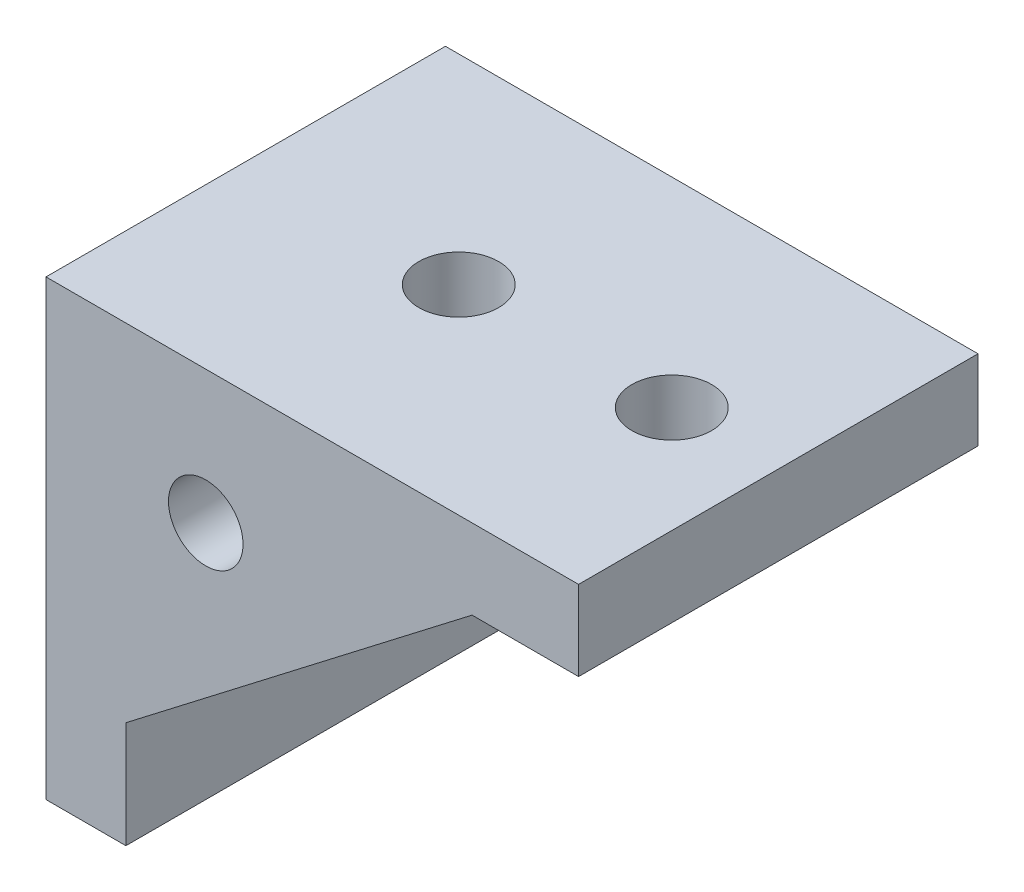
ISO-10303-21;
HEADER;
FILE_DESCRIPTION(('STEP AP214'),'2;1');
FILE_NAME('part.step','',(''),(''),'','','');
FILE_SCHEMA(('AUTOMOTIVE_DESIGN { 1 0 10303 214 1 1 1 1 }'));
ENDSEC;
DATA;
#1=APPLICATION_CONTEXT('core data for automotive mechanical design processes');
#2=APPLICATION_PROTOCOL_DEFINITION('international standard','automotive_design',2000,#1);
#3=PRODUCT_CONTEXT('',#1,'mechanical');
#4=PRODUCT('Part','Part','',(#3));
#5=PRODUCT_RELATED_PRODUCT_CATEGORY('part','',(#4));
#6=PRODUCT_DEFINITION_FORMATION('','',#4);
#7=PRODUCT_DEFINITION_CONTEXT('part definition',#1,'design');
#8=PRODUCT_DEFINITION('design','',#6,#7);
#9=PRODUCT_DEFINITION_SHAPE('','',#8);
#10=(LENGTH_UNIT() NAMED_UNIT(*) SI_UNIT(.MILLI.,.METRE.));
#11=(NAMED_UNIT(*) PLANE_ANGLE_UNIT() SI_UNIT($,.RADIAN.));
#12=(NAMED_UNIT(*) SI_UNIT($,.STERADIAN.) SOLID_ANGLE_UNIT());
#13=UNCERTAINTY_MEASURE_WITH_UNIT(LENGTH_MEASURE(1.E-05),#10,'distance_accuracy_value','');
#14=(GEOMETRIC_REPRESENTATION_CONTEXT(3) GLOBAL_UNCERTAINTY_ASSIGNED_CONTEXT((#13)) GLOBAL_UNIT_ASSIGNED_CONTEXT((#10,
#11,#12)) REPRESENTATION_CONTEXT('',''));
#15=CARTESIAN_POINT('',(0.,0.,0.));
#16=DIRECTION('',(0.,0.,1.));
#17=DIRECTION('',(1.,0.,0.));
#18=AXIS2_PLACEMENT_3D('',#15,#16,#17);
#19=CARTESIAN_POINT('',(-3.,-14.,15.));
#20=DIRECTION('',(0.,1.,0.));
#21=DIRECTION('',(0.,0.,1.));
#22=AXIS2_PLACEMENT_3D('',#19,#20,#21);
#23=PLANE('',#22);
#24=DIRECTION('',(1.,0.,0.));
#25=VECTOR('',#24,1.);
#26=CARTESIAN_POINT('',(-3.,-14.,0.));
#27=LINE('',#26,#25);
#28=CARTESIAN_POINT('',(-3.,-14.,0.));
#29=VERTEX_POINT('',#28);
#30=CARTESIAN_POINT('',(0.,-14.,0.));
#31=VERTEX_POINT('',#30);
#32=EDGE_CURVE('E185',#29,#31,#27,.T.);
#33=ORIENTED_EDGE('',*,*,#32,.T.);
#34=DIRECTION('',(0.,0.,-1.));
#35=VECTOR('',#34,1.);
#36=CARTESIAN_POINT('',(0.,-14.,15.));
#37=LINE('',#36,#35);
#38=CARTESIAN_POINT('',(0.,-14.,15.));
#39=VERTEX_POINT('',#38);
#40=EDGE_CURVE('E221',#39,#31,#37,.T.);
#41=ORIENTED_EDGE('',*,*,#40,.F.);
#42=DIRECTION('',(1.,0.,0.));
#43=VECTOR('',#42,1.);
#44=CARTESIAN_POINT('',(-3.,-14.,15.));
#45=LINE('',#44,#43);
#46=CARTESIAN_POINT('',(-3.,-14.,15.));
#47=VERTEX_POINT('',#46);
#48=EDGE_CURVE('E188',#47,#39,#45,.T.);
#49=ORIENTED_EDGE('',*,*,#48,.F.);
#50=DIRECTION('',(0.,0.,-1.));
#51=VECTOR('',#50,1.);
#52=CARTESIAN_POINT('',(-3.,-14.,15.));
#53=LINE('',#52,#51);
#54=EDGE_CURVE('E203',#47,#29,#53,.T.);
#55=ORIENTED_EDGE('',*,*,#54,.T.);
#56=EDGE_LOOP('',(#33,#41,#49,#55));
#57=FACE_BOUND('',#56,.T.);
#58=ADVANCED_FACE('F34',(#57),#23,.F.);
#59=CARTESIAN_POINT('',(0.,-14.,15.));
#60=DIRECTION('',(-1.,0.,0.));
#61=DIRECTION('',(0.,-1.,0.));
#62=AXIS2_PLACEMENT_3D('',#59,#60,#61);
#63=PLANE('',#62);
#64=CARTESIAN_POINT('',(0.,-6.,7.5));
#65=DIRECTION('',(1.,0.,0.));
#66=DIRECTION('',(0.,1.,0.));
#67=AXIS2_PLACEMENT_3D('',#64,#65,#66);
#68=CIRCLE('',#67,1.5);
#69=CARTESIAN_POINT('',(0.,-4.5,7.5));
#70=VERTEX_POINT('',#69);
#71=EDGE_CURVE('E179',#70,#70,#68,.T.);
#72=ORIENTED_EDGE('',*,*,#71,.F.);
#73=EDGE_LOOP('',(#72));
#74=FACE_BOUND('',#73,.T.);
#75=DIRECTION('',(0.,1.,0.));
#76=VECTOR('',#75,1.);
#77=CARTESIAN_POINT('',(0.,-10.,2.));
#78=LINE('',#77,#76);
#79=CARTESIAN_POINT('',(0.,-10.,2.));
#80=VERTEX_POINT('',#79);
#81=CARTESIAN_POINT('',(0.,-3.,2.));
#82=VERTEX_POINT('',#81);
#83=EDGE_CURVE('E143',#80,#82,#78,.T.);
#84=ORIENTED_EDGE('',*,*,#83,.T.);
#85=DIRECTION('',(0.,0.,-1.));
#86=VECTOR('',#85,1.);
#87=CARTESIAN_POINT('',(0.,-3.,13.));
#88=LINE('',#87,#86);
#89=CARTESIAN_POINT('',(0.,-3.,13.));
#90=VERTEX_POINT('',#89);
#91=EDGE_CURVE('E42',#82,#90,#88,.F.);
#92=ORIENTED_EDGE('',*,*,#91,.T.);
#93=DIRECTION('',(0.,-1.,0.));
#94=VECTOR('',#93,1.);
#95=CARTESIAN_POINT('',(0.,0.,13.));
#96=LINE('',#95,#94);
#97=CARTESIAN_POINT('',(0.,-10.,13.));
#98=VERTEX_POINT('',#97);
#99=EDGE_CURVE('E157',#90,#98,#96,.T.);
#100=ORIENTED_EDGE('',*,*,#99,.T.);
#101=DIRECTION('',(0.,0.,1.));
#102=VECTOR('',#101,1.);
#103=CARTESIAN_POINT('',(0.,-10.,13.));
#104=LINE('',#103,#102);
#105=CARTESIAN_POINT('',(0.,-10.,15.));
#106=VERTEX_POINT('',#105);
#107=EDGE_CURVE('E162',#98,#106,#104,.T.);
#108=ORIENTED_EDGE('',*,*,#107,.T.);
#109=DIRECTION('',(0.,1.,0.));
#110=VECTOR('',#109,1.);
#111=CARTESIAN_POINT('',(0.,-14.,15.));
#112=LINE('',#111,#110);
#113=EDGE_CURVE('E191',#39,#106,#112,.T.);
#114=ORIENTED_EDGE('',*,*,#113,.F.);
#115=ORIENTED_EDGE('',*,*,#40,.T.);
#116=DIRECTION('',(0.,1.,0.));
#117=VECTOR('',#116,1.);
#118=CARTESIAN_POINT('',(0.,-14.,0.));
#119=LINE('',#118,#117);
#120=CARTESIAN_POINT('',(0.,-10.,0.));
#121=VERTEX_POINT('',#120);
#122=EDGE_CURVE('E127',#31,#121,#119,.T.);
#123=ORIENTED_EDGE('',*,*,#122,.T.);
#124=DIRECTION('',(0.,0.,-1.));
#125=VECTOR('',#124,1.);
#126=CARTESIAN_POINT('',(0.,-10.,2.));
#127=LINE('',#126,#125);
#128=EDGE_CURVE('E138',#80,#121,#127,.T.);
#129=ORIENTED_EDGE('',*,*,#128,.F.);
#130=EDGE_LOOP('',(#84,#92,#100,#108,#114,#115,#123,#129));
#131=FACE_BOUND('',#130,.T.);
#132=ADVANCED_FACE('F256',(#74,#131),#63,.F.);
#133=CARTESIAN_POINT('',(0.,0.,15.));
#134=DIRECTION('',(0.,1.,0.));
#135=DIRECTION('',(0.,0.,1.));
#136=AXIS2_PLACEMENT_3D('',#133,#134,#135);
#137=PLANE('',#136);
#138=CARTESIAN_POINT('',(5.,0.,7.5));
#139=DIRECTION('',(0.,-1.,0.));
#140=DIRECTION('',(0.,0.,-1.));
#141=AXIS2_PLACEMENT_3D('',#138,#139,#140);
#142=CIRCLE('',#141,1.5);
#143=CARTESIAN_POINT('',(5.,0.,6.));
#144=VERTEX_POINT('',#143);
#145=EDGE_CURVE('E167',#144,#144,#142,.T.);
#146=ORIENTED_EDGE('',*,*,#145,.F.);
#147=EDGE_LOOP('',(#146));
#148=FACE_BOUND('',#147,.T.);
#149=CARTESIAN_POINT('',(13.,0.,7.5));
#150=DIRECTION('',(0.,-1.,0.));
#151=DIRECTION('',(0.,0.,-1.));
#152=AXIS2_PLACEMENT_3D('',#149,#150,#151);
#153=CIRCLE('',#152,1.5);
#154=CARTESIAN_POINT('',(13.,0.,6.));
#155=VERTEX_POINT('',#154);
#156=EDGE_CURVE('E173',#155,#155,#153,.T.);
#157=ORIENTED_EDGE('',*,*,#156,.F.);
#158=EDGE_LOOP('',(#157));
#159=FACE_BOUND('',#158,.T.);
#160=DIRECTION('',(-1.,0.,0.));
#161=VECTOR('',#160,1.);
#162=CARTESIAN_POINT('',(0.,0.,13.));
#163=LINE('',#162,#161);
#164=CARTESIAN_POINT('',(13.,0.,13.));
#165=VERTEX_POINT('',#164);
#166=CARTESIAN_POINT('',(3.,0.,13.));
#167=VERTEX_POINT('',#166);
#168=EDGE_CURVE('E155',#165,#167,#163,.T.);
#169=ORIENTED_EDGE('',*,*,#168,.T.);
#170=DIRECTION('',(0.,0.,-1.));
#171=VECTOR('',#170,1.);
#172=CARTESIAN_POINT('',(3.,0.,2.));
#173=LINE('',#172,#171);
#174=CARTESIAN_POINT('',(3.,0.,2.));
#175=VERTEX_POINT('',#174);
#176=EDGE_CURVE('E224',#167,#175,#173,.T.);
#177=ORIENTED_EDGE('',*,*,#176,.T.);
#178=DIRECTION('',(1.,0.,0.));
#179=VECTOR('',#178,1.);
#180=CARTESIAN_POINT('',(0.,0.,2.));
#181=LINE('',#180,#179);
#182=CARTESIAN_POINT('',(13.,0.,2.));
#183=VERTEX_POINT('',#182);
#184=EDGE_CURVE('E134',#175,#183,#181,.T.);
#185=ORIENTED_EDGE('',*,*,#184,.T.);
#186=DIRECTION('',(0.,0.,-1.));
#187=VECTOR('',#186,1.);
#188=CARTESIAN_POINT('',(13.,0.,2.));
#189=LINE('',#188,#187);
#190=CARTESIAN_POINT('',(13.,0.,0.));
#191=VERTEX_POINT('',#190);
#192=EDGE_CURVE('E130',#183,#191,#189,.T.);
#193=ORIENTED_EDGE('',*,*,#192,.T.);
#194=DIRECTION('',(1.,0.,0.));
#195=VECTOR('',#194,1.);
#196=CARTESIAN_POINT('',(0.,0.,0.));
#197=LINE('',#196,#195);
#198=CARTESIAN_POINT('',(17.,0.,0.));
#199=VERTEX_POINT('',#198);
#200=EDGE_CURVE('E116',#191,#199,#197,.T.);
#201=ORIENTED_EDGE('',*,*,#200,.T.);
#202=DIRECTION('',(0.,0.,-1.));
#203=VECTOR('',#202,1.);
#204=CARTESIAN_POINT('',(17.,0.,15.));
#205=LINE('',#204,#203);
#206=CARTESIAN_POINT('',(17.,0.,15.));
#207=VERTEX_POINT('',#206);
#208=EDGE_CURVE('E219',#207,#199,#205,.T.);
#209=ORIENTED_EDGE('',*,*,#208,.F.);
#210=DIRECTION('',(1.,0.,0.));
#211=VECTOR('',#210,1.);
#212=CARTESIAN_POINT('',(0.,0.,15.));
#213=LINE('',#212,#211);
#214=CARTESIAN_POINT('',(13.,0.,15.));
#215=VERTEX_POINT('',#214);
#216=EDGE_CURVE('E195',#215,#207,#213,.T.);
#217=ORIENTED_EDGE('',*,*,#216,.F.);
#218=DIRECTION('',(0.,0.,1.));
#219=VECTOR('',#218,1.);
#220=CARTESIAN_POINT('',(13.,0.,13.));
#221=LINE('',#220,#219);
#222=EDGE_CURVE('E165',#165,#215,#221,.T.);
#223=ORIENTED_EDGE('',*,*,#222,.F.);
#224=EDGE_LOOP('',(#169,#177,#185,#193,#201,#209,#217,#223));
#225=FACE_BOUND('',#224,.T.);
#226=ADVANCED_FACE('F132',(#148,#159,#225),#137,.F.);
#227=CARTESIAN_POINT('',(17.,0.,15.));
#228=DIRECTION('',(-1.,0.,0.));
#229=DIRECTION('',(0.,0.,1.));
#230=AXIS2_PLACEMENT_3D('',#227,#228,#229);
#231=PLANE('',#230);
#232=DIRECTION('',(0.,1.,0.));
#233=VECTOR('',#232,1.);
#234=CARTESIAN_POINT('',(17.,0.,0.));
#235=LINE('',#234,#233);
#236=CARTESIAN_POINT('',(17.,3.,0.));
#237=VERTEX_POINT('',#236);
#238=EDGE_CURVE('E123',#199,#237,#235,.T.);
#239=ORIENTED_EDGE('',*,*,#238,.T.);
#240=DIRECTION('',(0.,0.,-1.));
#241=VECTOR('',#240,1.);
#242=CARTESIAN_POINT('',(17.,3.,15.));
#243=LINE('',#242,#241);
#244=CARTESIAN_POINT('',(17.,3.,15.));
#245=VERTEX_POINT('',#244);
#246=EDGE_CURVE('E216',#245,#237,#243,.T.);
#247=ORIENTED_EDGE('',*,*,#246,.F.);
#248=DIRECTION('',(0.,1.,0.));
#249=VECTOR('',#248,1.);
#250=CARTESIAN_POINT('',(17.,0.,15.));
#251=LINE('',#250,#249);
#252=EDGE_CURVE('E197',#207,#245,#251,.T.);
#253=ORIENTED_EDGE('',*,*,#252,.F.);
#254=ORIENTED_EDGE('',*,*,#208,.T.);
#255=EDGE_LOOP('',(#239,#247,#253,#254));
#256=FACE_BOUND('',#255,.T.);
#257=ADVANCED_FACE('F266',(#256),#231,.F.);
#258=CARTESIAN_POINT('',(17.,3.,15.));
#259=DIRECTION('',(0.,-1.,0.));
#260=DIRECTION('',(1.,0.,0.));
#261=AXIS2_PLACEMENT_3D('',#258,#259,#260);
#262=PLANE('',#261);
#263=CARTESIAN_POINT('',(5.,3.,7.5));
#264=DIRECTION('',(0.,-1.,0.));
#265=DIRECTION('',(0.,0.,-1.));
#266=AXIS2_PLACEMENT_3D('',#263,#264,#265);
#267=CIRCLE('',#266,1.5);
#268=CARTESIAN_POINT('',(5.,3.,6.));
#269=VERTEX_POINT('',#268);
#270=EDGE_CURVE('E170',#269,#269,#267,.T.);
#271=ORIENTED_EDGE('',*,*,#270,.T.);
#272=EDGE_LOOP('',(#271));
#273=FACE_BOUND('',#272,.T.);
#274=CARTESIAN_POINT('',(13.,3.,7.5));
#275=DIRECTION('',(0.,-1.,0.));
#276=DIRECTION('',(0.,0.,-1.));
#277=AXIS2_PLACEMENT_3D('',#274,#275,#276);
#278=CIRCLE('',#277,1.5);
#279=CARTESIAN_POINT('',(13.,3.,6.));
#280=VERTEX_POINT('',#279);
#281=EDGE_CURVE('E176',#280,#280,#278,.T.);
#282=ORIENTED_EDGE('',*,*,#281,.T.);
#283=EDGE_LOOP('',(#282));
#284=FACE_BOUND('',#283,.T.);
#285=DIRECTION('',(-1.,0.,0.));
#286=VECTOR('',#285,1.);
#287=CARTESIAN_POINT('',(17.,3.,0.));
#288=LINE('',#287,#286);
#289=CARTESIAN_POINT('',(-3.,3.,0.));
#290=VERTEX_POINT('',#289);
#291=EDGE_CURVE('E208',#237,#290,#288,.T.);
#292=ORIENTED_EDGE('',*,*,#291,.T.);
#293=DIRECTION('',(0.,0.,-1.));
#294=VECTOR('',#293,1.);
#295=CARTESIAN_POINT('',(-3.,3.,15.));
#296=LINE('',#295,#294);
#297=CARTESIAN_POINT('',(-3.,3.,15.));
#298=VERTEX_POINT('',#297);
#299=EDGE_CURVE('E213',#298,#290,#296,.T.);
#300=ORIENTED_EDGE('',*,*,#299,.F.);
#301=DIRECTION('',(-1.,0.,0.));
#302=VECTOR('',#301,1.);
#303=CARTESIAN_POINT('',(17.,3.,15.));
#304=LINE('',#303,#302);
#305=EDGE_CURVE('E199',#245,#298,#304,.T.);
#306=ORIENTED_EDGE('',*,*,#305,.F.);
#307=ORIENTED_EDGE('',*,*,#246,.T.);
#308=EDGE_LOOP('',(#292,#300,#306,#307));
#309=FACE_BOUND('',#308,.T.);
#310=ADVANCED_FACE('F270',(#273,#284,#309),#262,.F.);
#311=CARTESIAN_POINT('',(-3.,3.,15.));
#312=DIRECTION('',(1.,0.,0.));
#313=DIRECTION('',(0.,1.,0.));
#314=AXIS2_PLACEMENT_3D('',#311,#312,#313);
#315=PLANE('',#314);
#316=CARTESIAN_POINT('',(-3.,-6.,7.5));
#317=DIRECTION('',(1.,0.,0.));
#318=DIRECTION('',(0.,1.,0.));
#319=AXIS2_PLACEMENT_3D('',#316,#317,#318);
#320=CIRCLE('',#319,1.5);
#321=CARTESIAN_POINT('',(-3.,-4.5,7.5));
#322=VERTEX_POINT('',#321);
#323=EDGE_CURVE('E182',#322,#322,#320,.T.);
#324=ORIENTED_EDGE('',*,*,#323,.T.);
#325=EDGE_LOOP('',(#324));
#326=FACE_BOUND('',#325,.T.);
#327=DIRECTION('',(0.,-1.,0.));
#328=VECTOR('',#327,1.);
#329=CARTESIAN_POINT('',(-3.,3.,0.));
#330=LINE('',#329,#328);
#331=EDGE_CURVE('E192',#290,#29,#330,.T.);
#332=ORIENTED_EDGE('',*,*,#331,.T.);
#333=ORIENTED_EDGE('',*,*,#54,.F.);
#334=DIRECTION('',(0.,-1.,0.));
#335=VECTOR('',#334,1.);
#336=CARTESIAN_POINT('',(-3.,3.,15.));
#337=LINE('',#336,#335);
#338=EDGE_CURVE('E201',#298,#47,#337,.T.);
#339=ORIENTED_EDGE('',*,*,#338,.F.);
#340=ORIENTED_EDGE('',*,*,#299,.T.);
#341=EDGE_LOOP('',(#332,#333,#339,#340));
#342=FACE_BOUND('',#341,.T.);
#343=ADVANCED_FACE('F274',(#326,#342),#315,.F.);
#344=CARTESIAN_POINT('',(0.,0.,15.));
#345=DIRECTION('',(0.,0.,1.));
#346=DIRECTION('',(1.,0.,0.));
#347=AXIS2_PLACEMENT_3D('',#344,#345,#346);
#348=PLANE('',#347);
#349=CARTESIAN_POINT('',(3.,-2.,15.));
#350=DIRECTION('',(0.,0.,-1.));
#351=DIRECTION('',(-1.,0.,0.));
#352=AXIS2_PLACEMENT_3D('',#349,#350,#351);
#353=CIRCLE('',#352,1.4);
#354=CARTESIAN_POINT('',(1.6,-2.,15.));
#355=VERTEX_POINT('',#354);
#356=EDGE_CURVE('E227',#355,#355,#353,.T.);
#357=ORIENTED_EDGE('',*,*,#356,.T.);
#358=EDGE_LOOP('',(#357));
#359=FACE_BOUND('',#358,.T.);
#360=DIRECTION('',(0.7926239891046,0.609710760849693,0.));
#361=VECTOR('',#360,1.);
#362=CARTESIAN_POINT('',(13.,0.,15.));
#363=LINE('',#362,#361);
#364=EDGE_CURVE('E153',#106,#215,#363,.T.);
#365=ORIENTED_EDGE('',*,*,#364,.T.);
#366=ORIENTED_EDGE('',*,*,#216,.T.);
#367=ORIENTED_EDGE('',*,*,#252,.T.);
#368=ORIENTED_EDGE('',*,*,#305,.T.);
#369=ORIENTED_EDGE('',*,*,#338,.T.);
#370=ORIENTED_EDGE('',*,*,#48,.T.);
#371=ORIENTED_EDGE('',*,*,#113,.T.);
#372=EDGE_LOOP('',(#365,#366,#367,#368,#369,#370,#371));
#373=FACE_BOUND('',#372,.T.);
#374=ADVANCED_FACE('F241',(#359,#373),#348,.T.);
#375=CARTESIAN_POINT('',(0.,0.,0.));
#376=DIRECTION('',(0.,0.,1.));
#377=DIRECTION('',(1.,0.,0.));
#378=AXIS2_PLACEMENT_3D('',#375,#376,#377);
#379=PLANE('',#378);
#380=CARTESIAN_POINT('',(3.,-2.,0.));
#381=DIRECTION('',(0.,0.,-1.));
#382=DIRECTION('',(-1.,0.,0.));
#383=AXIS2_PLACEMENT_3D('',#380,#381,#382);
#384=CIRCLE('',#383,1.4);
#385=CARTESIAN_POINT('',(1.6,-2.,0.));
#386=VERTEX_POINT('',#385);
#387=EDGE_CURVE('E235',#386,#386,#384,.T.);
#388=ORIENTED_EDGE('',*,*,#387,.F.);
#389=EDGE_LOOP('',(#388));
#390=FACE_BOUND('',#389,.T.);
#391=ORIENTED_EDGE('',*,*,#32,.F.);
#392=ORIENTED_EDGE('',*,*,#331,.F.);
#393=ORIENTED_EDGE('',*,*,#291,.F.);
#394=ORIENTED_EDGE('',*,*,#238,.F.);
#395=ORIENTED_EDGE('',*,*,#200,.F.);
#396=DIRECTION('',(-0.7926239891046,-0.609710760849693,0.));
#397=VECTOR('',#396,1.);
#398=CARTESIAN_POINT('',(13.,0.,0.));
#399=LINE('',#398,#397);
#400=EDGE_CURVE('E121',#191,#121,#399,.T.);
#401=ORIENTED_EDGE('',*,*,#400,.T.);
#402=ORIENTED_EDGE('',*,*,#122,.F.);
#403=EDGE_LOOP('',(#391,#392,#393,#394,#395,#401,#402));
#404=FACE_BOUND('',#403,.T.);
#405=ADVANCED_FACE('F119',(#390,#404),#379,.F.);
#406=CARTESIAN_POINT('',(-3.,-6.,7.5));
#407=DIRECTION('',(1.,0.,0.));
#408=DIRECTION('',(0.,1.,0.));
#409=AXIS2_PLACEMENT_3D('',#406,#407,#408);
#410=CYLINDRICAL_SURFACE('',#409,1.5);
#411=ORIENTED_EDGE('',*,*,#323,.F.);
#412=EDGE_LOOP('',(#411));
#413=FACE_BOUND('',#412,.T.);
#414=ORIENTED_EDGE('',*,*,#71,.T.);
#415=EDGE_LOOP('',(#414));
#416=FACE_BOUND('',#415,.T.);
#417=ADVANCED_FACE('F281',(#413,#416),#410,.F.);
#418=CARTESIAN_POINT('',(13.,3.,7.5));
#419=DIRECTION('',(0.,-1.,0.));
#420=DIRECTION('',(0.,0.,-1.));
#421=AXIS2_PLACEMENT_3D('',#418,#419,#420);
#422=CYLINDRICAL_SURFACE('',#421,1.5);
#423=ORIENTED_EDGE('',*,*,#281,.F.);
#424=EDGE_LOOP('',(#423));
#425=FACE_BOUND('',#424,.T.);
#426=ORIENTED_EDGE('',*,*,#156,.T.);
#427=EDGE_LOOP('',(#426));
#428=FACE_BOUND('',#427,.T.);
#429=ADVANCED_FACE('F287',(#425,#428),#422,.F.);
#430=CARTESIAN_POINT('',(5.,3.,7.5));
#431=DIRECTION('',(0.,-1.,0.));
#432=DIRECTION('',(0.,0.,-1.));
#433=AXIS2_PLACEMENT_3D('',#430,#431,#432);
#434=CYLINDRICAL_SURFACE('',#433,1.5);
#435=ORIENTED_EDGE('',*,*,#270,.F.);
#436=EDGE_LOOP('',(#435));
#437=FACE_BOUND('',#436,.T.);
#438=ORIENTED_EDGE('',*,*,#145,.T.);
#439=EDGE_LOOP('',(#438));
#440=FACE_BOUND('',#439,.T.);
#441=ADVANCED_FACE('F291',(#437,#440),#434,.F.);
#442=CARTESIAN_POINT('',(13.,0.,13.));
#443=DIRECTION('',(0.609710760849693,-0.7926239891046,0.));
#444=DIRECTION('',(0.7926239891046,0.609710760849693,0.));
#445=AXIS2_PLACEMENT_3D('',#442,#443,#444);
#446=PLANE('',#445);
#447=ORIENTED_EDGE('',*,*,#364,.F.);
#448=ORIENTED_EDGE('',*,*,#107,.F.);
#449=DIRECTION('',(0.7926239891046,0.609710760849693,0.));
#450=VECTOR('',#449,1.);
#451=CARTESIAN_POINT('',(13.,0.,13.));
#452=LINE('',#451,#450);
#453=EDGE_CURVE('E159',#98,#165,#452,.T.);
#454=ORIENTED_EDGE('',*,*,#453,.T.);
#455=ORIENTED_EDGE('',*,*,#222,.T.);
#456=EDGE_LOOP('',(#447,#448,#454,#455));
#457=FACE_BOUND('',#456,.T.);
#458=ADVANCED_FACE('F295',(#457),#446,.T.);
#459=CARTESIAN_POINT('',(0.,0.,13.));
#460=DIRECTION('',(0.,0.,-1.));
#461=DIRECTION('',(-1.,0.,0.));
#462=AXIS2_PLACEMENT_3D('',#459,#460,#461);
#463=PLANE('',#462);
#464=CARTESIAN_POINT('',(3.,-2.,13.));
#465=DIRECTION('',(0.,0.,-1.));
#466=DIRECTION('',(-1.,0.,0.));
#467=AXIS2_PLACEMENT_3D('',#464,#465,#466);
#468=CIRCLE('',#467,1.4);
#469=CARTESIAN_POINT('',(1.6,-2.,13.));
#470=VERTEX_POINT('',#469);
#471=EDGE_CURVE('E144',#470,#470,#468,.T.);
#472=ORIENTED_EDGE('',*,*,#471,.F.);
#473=EDGE_LOOP('',(#472));
#474=FACE_BOUND('',#473,.T.);
#475=ORIENTED_EDGE('',*,*,#99,.F.);
#476=CARTESIAN_POINT('',(3.,-3.,13.));
#477=DIRECTION('',(0.,0.,-1.));
#478=DIRECTION('',(-1.,0.,0.));
#479=AXIS2_PLACEMENT_3D('',#476,#477,#478);
#480=CIRCLE('',#479,3.);
#481=EDGE_CURVE('E11',#90,#167,#480,.T.);
#482=ORIENTED_EDGE('',*,*,#481,.T.);
#483=ORIENTED_EDGE('',*,*,#168,.F.);
#484=ORIENTED_EDGE('',*,*,#453,.F.);
#485=EDGE_LOOP('',(#475,#482,#483,#484));
#486=FACE_BOUND('',#485,.T.);
#487=ADVANCED_FACE('F299',(#474,#486),#463,.T.);
#488=CARTESIAN_POINT('',(13.,0.,2.));
#489=DIRECTION('',(0.609710760849693,-0.7926239891046,0.));
#490=DIRECTION('',(0.7926239891046,0.609710760849693,0.));
#491=AXIS2_PLACEMENT_3D('',#488,#489,#490);
#492=PLANE('',#491);
#493=ORIENTED_EDGE('',*,*,#400,.F.);
#494=ORIENTED_EDGE('',*,*,#192,.F.);
#495=DIRECTION('',(-0.7926239891046,-0.609710760849693,0.));
#496=VECTOR('',#495,1.);
#497=CARTESIAN_POINT('',(13.,0.,2.));
#498=LINE('',#497,#496);
#499=EDGE_CURVE('E139',#183,#80,#498,.T.);
#500=ORIENTED_EDGE('',*,*,#499,.T.);
#501=ORIENTED_EDGE('',*,*,#128,.T.);
#502=EDGE_LOOP('',(#493,#494,#500,#501));
#503=FACE_BOUND('',#502,.T.);
#504=ADVANCED_FACE('F142',(#503),#492,.T.);
#505=CARTESIAN_POINT('',(0.,0.,2.));
#506=DIRECTION('',(0.,0.,-1.));
#507=DIRECTION('',(-1.,0.,0.));
#508=AXIS2_PLACEMENT_3D('',#505,#506,#507);
#509=PLANE('',#508);
#510=CARTESIAN_POINT('',(3.,-2.,2.));
#511=DIRECTION('',(0.,0.,-1.));
#512=DIRECTION('',(-1.,0.,0.));
#513=AXIS2_PLACEMENT_3D('',#510,#511,#512);
#514=CIRCLE('',#513,1.4);
#515=CARTESIAN_POINT('',(1.6,-2.,2.));
#516=VERTEX_POINT('',#515);
#517=EDGE_CURVE('E148',#516,#516,#514,.T.);
#518=ORIENTED_EDGE('',*,*,#517,.T.);
#519=EDGE_LOOP('',(#518));
#520=FACE_BOUND('',#519,.T.);
#521=ORIENTED_EDGE('',*,*,#184,.F.);
#522=CARTESIAN_POINT('',(3.,-3.,2.));
#523=DIRECTION('',(0.,0.,-1.));
#524=DIRECTION('',(-1.,0.,0.));
#525=AXIS2_PLACEMENT_3D('',#522,#523,#524);
#526=CIRCLE('',#525,3.);
#527=EDGE_CURVE('E56',#175,#82,#526,.F.);
#528=ORIENTED_EDGE('',*,*,#527,.T.);
#529=ORIENTED_EDGE('',*,*,#83,.F.);
#530=ORIENTED_EDGE('',*,*,#499,.F.);
#531=EDGE_LOOP('',(#521,#528,#529,#530));
#532=FACE_BOUND('',#531,.T.);
#533=ADVANCED_FACE('F233',(#520,#532),#509,.F.);
#534=CARTESIAN_POINT('',(3.,-2.,15.));
#535=DIRECTION('',(0.,0.,-1.));
#536=DIRECTION('',(-1.,0.,0.));
#537=AXIS2_PLACEMENT_3D('',#534,#535,#536);
#538=CYLINDRICAL_SURFACE('',#537,1.4);
#539=ORIENTED_EDGE('',*,*,#387,.T.);
#540=EDGE_LOOP('',(#539));
#541=FACE_BOUND('',#540,.T.);
#542=ORIENTED_EDGE('',*,*,#517,.F.);
#543=EDGE_LOOP('',(#542));
#544=FACE_BOUND('',#543,.T.);
#545=ADVANCED_FACE('F246',(#541,#544),#538,.F.);
#546=ORIENTED_EDGE('',*,*,#471,.T.);
#547=EDGE_LOOP('',(#546));
#548=FACE_BOUND('',#547,.T.);
#549=ORIENTED_EDGE('',*,*,#356,.F.);
#550=EDGE_LOOP('',(#549));
#551=FACE_BOUND('',#550,.T.);
#552=ADVANCED_FACE('F244',(#548,#551),#538,.F.);
#553=CARTESIAN_POINT('',(3.,-3.,15.));
#554=DIRECTION('',(0.,0.,1.));
#555=DIRECTION('',(1.,0.,0.));
#556=AXIS2_PLACEMENT_3D('',#553,#554,#555);
#557=CYLINDRICAL_SURFACE('',#556,3.);
#558=ORIENTED_EDGE('',*,*,#481,.F.);
#559=ORIENTED_EDGE('',*,*,#91,.F.);
#560=ORIENTED_EDGE('',*,*,#527,.F.);
#561=ORIENTED_EDGE('',*,*,#176,.F.);
#562=EDGE_LOOP('',(#558,#559,#560,#561));
#563=FACE_BOUND('',#562,.T.);
#564=ADVANCED_FACE('F36',(#563),#557,.F.);
#565=CLOSED_SHELL('',(#58,#132,#226,#257,#310,#343,#374,#405,#417,#429,#441,#458,#487,#504,#533,
#545,#552,#564));
#566=MANIFOLD_SOLID_BREP('B2',#565);
#567=ADVANCED_BREP_SHAPE_REPRESENTATION('',(#18,#566),#14);
#568=SHAPE_DEFINITION_REPRESENTATION(#9,#567);
ENDSEC;
END-ISO-10303-21;
